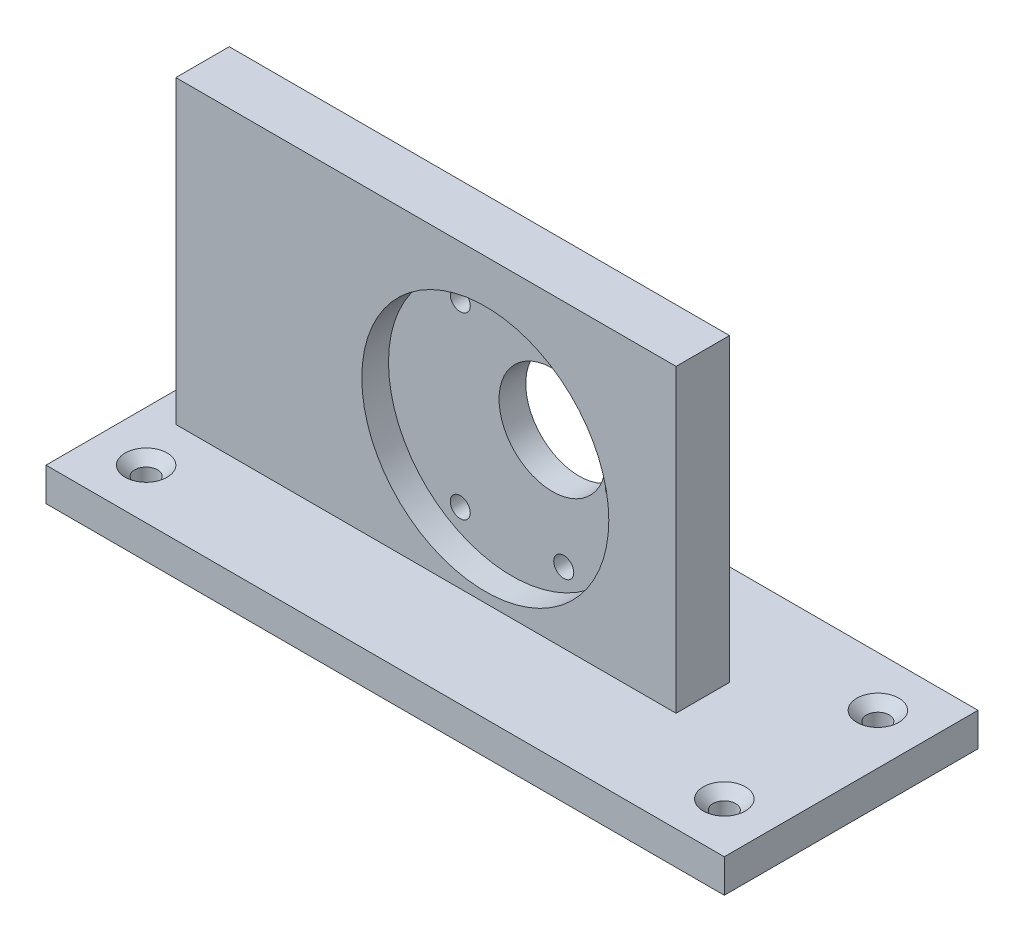
ISO-10303-21;
HEADER;
FILE_DESCRIPTION(('STEP AP214'),'2;1');
FILE_NAME('part.step','',(''),(''),'','','');
FILE_SCHEMA(('AUTOMOTIVE_DESIGN { 1 0 10303 214 1 1 1 1 }'));
ENDSEC;
DATA;
#1=APPLICATION_CONTEXT('core data for automotive mechanical design processes');
#2=APPLICATION_PROTOCOL_DEFINITION('international standard','automotive_design',2000,#1);
#3=PRODUCT_CONTEXT('',#1,'mechanical');
#4=PRODUCT('Part','Part','',(#3));
#5=PRODUCT_RELATED_PRODUCT_CATEGORY('part','',(#4));
#6=PRODUCT_DEFINITION_FORMATION('','',#4);
#7=PRODUCT_DEFINITION_CONTEXT('part definition',#1,'design');
#8=PRODUCT_DEFINITION('design','',#6,#7);
#9=PRODUCT_DEFINITION_SHAPE('','',#8);
#10=(LENGTH_UNIT() NAMED_UNIT(*) SI_UNIT(.MILLI.,.METRE.));
#11=(NAMED_UNIT(*) PLANE_ANGLE_UNIT() SI_UNIT($,.RADIAN.));
#12=(NAMED_UNIT(*) SI_UNIT($,.STERADIAN.) SOLID_ANGLE_UNIT());
#13=UNCERTAINTY_MEASURE_WITH_UNIT(LENGTH_MEASURE(1.E-05),#10,'distance_accuracy_value','');
#14=(GEOMETRIC_REPRESENTATION_CONTEXT(3) GLOBAL_UNCERTAINTY_ASSIGNED_CONTEXT((#13)) GLOBAL_UNIT_ASSIGNED_CONTEXT((#10,
#11,#12)) REPRESENTATION_CONTEXT('',''));
#15=CARTESIAN_POINT('',(0.,0.,0.));
#16=DIRECTION('',(0.,0.,1.));
#17=DIRECTION('',(1.,0.,0.));
#18=AXIS2_PLACEMENT_3D('',#15,#16,#17);
#19=CARTESIAN_POINT('',(-50.8,5.,23.));
#20=DIRECTION('',(0.,-1.,0.));
#21=DIRECTION('',(1.,0.,0.));
#22=AXIS2_PLACEMENT_3D('',#19,#20,#21);
#23=PLANE('',#22);
#24=DIRECTION('',(-1.,0.,0.));
#25=VECTOR('',#24,1.);
#26=CARTESIAN_POINT('',(-50.8,5.,-15.));
#27=LINE('',#26,#25);
#28=CARTESIAN_POINT('',(50.8,5.00000000000002,-15.));
#29=VERTEX_POINT('',#28);
#30=CARTESIAN_POINT('',(-25.7177120902274,5.00000000000001,-15.));
#31=VERTEX_POINT('',#30);
#32=EDGE_CURVE('E258',#29,#31,#27,.T.);
#33=ORIENTED_EDGE('',*,*,#32,.T.);
#34=DIRECTION('',(0.,0.,-1.));
#35=VECTOR('',#34,1.);
#36=CARTESIAN_POINT('',(-25.7177120902274,5.00000000000001,-15.));
#37=LINE('',#36,#35);
#38=CARTESIAN_POINT('',(-25.7177120902274,5.00000000000001,-3.01915184565478));
#39=VERTEX_POINT('',#38);
#40=EDGE_CURVE('E195',#39,#31,#37,.T.);
#41=ORIENTED_EDGE('',*,*,#40,.F.);
#42=DIRECTION('',(1.,0.,0.));
#43=VECTOR('',#42,1.);
#44=CARTESIAN_POINT('',(-50.8,5.,-3.01915184565478));
#45=LINE('',#44,#43);
#46=CARTESIAN_POINT('',(-50.8,5.,-3.01915184565478));
#47=VERTEX_POINT('',#46);
#48=EDGE_CURVE('E191',#47,#39,#45,.T.);
#49=ORIENTED_EDGE('',*,*,#48,.F.);
#50=DIRECTION('',(0.,0.,-1.));
#51=VECTOR('',#50,1.);
#52=CARTESIAN_POINT('',(-50.8,5.,23.));
#53=LINE('',#52,#51);
#54=CARTESIAN_POINT('',(-50.8,5.,23.));
#55=VERTEX_POINT('',#54);
#56=EDGE_CURVE('E275',#55,#47,#53,.T.);
#57=ORIENTED_EDGE('',*,*,#56,.F.);
#58=DIRECTION('',(-1.,0.,0.));
#59=VECTOR('',#58,1.);
#60=CARTESIAN_POINT('',(-50.8,5.,23.));
#61=LINE('',#60,#59);
#62=CARTESIAN_POINT('',(50.8,5.00000000000002,23.));
#63=VERTEX_POINT('',#62);
#64=EDGE_CURVE('E272',#63,#55,#61,.T.);
#65=ORIENTED_EDGE('',*,*,#64,.F.);
#66=DIRECTION('',(0.,0.,-1.));
#67=VECTOR('',#66,1.);
#68=CARTESIAN_POINT('',(50.8,5.00000000000002,23.));
#69=LINE('',#68,#67);
#70=EDGE_CURVE('E279',#63,#29,#69,.T.);
#71=ORIENTED_EDGE('',*,*,#70,.T.);
#72=EDGE_LOOP('',(#33,#41,#49,#57,#65,#71));
#73=FACE_BOUND('',#72,.T.);
#74=CARTESIAN_POINT('',(43.3,5.00000000000002,-7.50000000000001));
#75=DIRECTION('',(0.,1.,0.));
#76=DIRECTION('',(0.,0.,1.));
#77=AXIS2_PLACEMENT_3D('',#74,#75,#76);
#78=CIRCLE('',#77,3.15);
#79=CARTESIAN_POINT('',(43.3,5.00000000000002,-4.35000000000001));
#80=VERTEX_POINT('',#79);
#81=EDGE_CURVE('E239',#80,#80,#78,.T.);
#82=ORIENTED_EDGE('',*,*,#81,.F.);
#83=EDGE_LOOP('',(#82));
#84=FACE_BOUND('',#83,.T.);
#85=CARTESIAN_POINT('',(43.3,5.00000000000002,15.5));
#86=DIRECTION('',(0.,1.,0.));
#87=DIRECTION('',(0.,0.,1.));
#88=AXIS2_PLACEMENT_3D('',#85,#86,#87);
#89=CIRCLE('',#88,3.15);
#90=CARTESIAN_POINT('',(43.3,5.00000000000002,18.65));
#91=VERTEX_POINT('',#90);
#92=EDGE_CURVE('E227',#91,#91,#89,.T.);
#93=ORIENTED_EDGE('',*,*,#92,.F.);
#94=EDGE_LOOP('',(#93));
#95=FACE_BOUND('',#94,.T.);
#96=CARTESIAN_POINT('',(-43.3,5.,15.5));
#97=DIRECTION('',(0.,1.,0.));
#98=DIRECTION('',(0.,0.,1.));
#99=AXIS2_PLACEMENT_3D('',#96,#97,#98);
#100=CIRCLE('',#99,3.15);
#101=CARTESIAN_POINT('',(-43.3,5.,18.65));
#102=VERTEX_POINT('',#101);
#103=EDGE_CURVE('E215',#102,#102,#100,.T.);
#104=ORIENTED_EDGE('',*,*,#103,.F.);
#105=EDGE_LOOP('',(#104));
#106=FACE_BOUND('',#105,.T.);
#107=DIRECTION('',(0.,0.,1.));
#108=VECTOR('',#107,1.);
#109=CARTESIAN_POINT('',(-46.355,5.,8.));
#110=LINE('',#109,#108);
#111=CARTESIAN_POINT('',(-46.355,5.,0.));
#112=VERTEX_POINT('',#111);
#113=CARTESIAN_POINT('',(-46.355,5.,8.));
#114=VERTEX_POINT('',#113);
#115=EDGE_CURVE('E178',#112,#114,#110,.T.);
#116=ORIENTED_EDGE('',*,*,#115,.F.);
#117=DIRECTION('',(-1.,0.,0.));
#118=VECTOR('',#117,1.);
#119=CARTESIAN_POINT('',(0.,5.00000000000001,0.));
#120=LINE('',#119,#118);
#121=CARTESIAN_POINT('',(28.575,5.00000000000002,0.));
#122=VERTEX_POINT('',#121);
#123=EDGE_CURVE('E87',#122,#112,#120,.T.);
#124=ORIENTED_EDGE('',*,*,#123,.F.);
#125=DIRECTION('',(0.,0.,-1.));
#126=VECTOR('',#125,1.);
#127=CARTESIAN_POINT('',(28.575,5.00000000000001,8.));
#128=LINE('',#127,#126);
#129=CARTESIAN_POINT('',(28.575,5.00000000000001,8.));
#130=VERTEX_POINT('',#129);
#131=EDGE_CURVE('E290',#130,#122,#128,.T.);
#132=ORIENTED_EDGE('',*,*,#131,.F.);
#133=DIRECTION('',(-1.,0.,0.));
#134=VECTOR('',#133,1.);
#135=CARTESIAN_POINT('',(0.,5.00000000000001,8.));
#136=LINE('',#135,#134);
#137=EDGE_CURVE('E94',#130,#114,#136,.T.);
#138=ORIENTED_EDGE('',*,*,#137,.T.);
#139=EDGE_LOOP('',(#116,#124,#132,#138));
#140=FACE_BOUND('',#139,.T.);
#141=ADVANCED_FACE('F71',(#73,#84,#95,#106,#140),#23,.F.);
#142=CARTESIAN_POINT('',(28.575,50.,8.));
#143=DIRECTION('',(1.,0.,0.));
#144=DIRECTION('',(0.,1.,0.));
#145=AXIS2_PLACEMENT_3D('',#142,#143,#144);
#146=PLANE('',#145);
#147=DIRECTION('',(0.,-1.,0.));
#148=VECTOR('',#147,1.);
#149=CARTESIAN_POINT('',(28.575,50.,8.));
#150=LINE('',#149,#148);
#151=CARTESIAN_POINT('',(28.575,50.,8.));
#152=VERTEX_POINT('',#151);
#153=EDGE_CURVE('E351',#152,#130,#150,.T.);
#154=ORIENTED_EDGE('',*,*,#153,.T.);
#155=ORIENTED_EDGE('',*,*,#131,.T.);
#156=DIRECTION('',(0.,-1.,0.));
#157=VECTOR('',#156,1.);
#158=CARTESIAN_POINT('',(28.575,50.,0.));
#159=LINE('',#158,#157);
#160=CARTESIAN_POINT('',(28.575,50.,0.));
#161=VERTEX_POINT('',#160);
#162=EDGE_CURVE('E164',#161,#122,#159,.T.);
#163=ORIENTED_EDGE('',*,*,#162,.F.);
#164=DIRECTION('',(0.,0.,-1.));
#165=VECTOR('',#164,1.);
#166=CARTESIAN_POINT('',(28.575,50.,8.));
#167=LINE('',#166,#165);
#168=EDGE_CURVE('E161',#152,#161,#167,.T.);
#169=ORIENTED_EDGE('',*,*,#168,.F.);
#170=EDGE_LOOP('',(#154,#155,#163,#169));
#171=FACE_BOUND('',#170,.T.);
#172=ADVANCED_FACE('F386',(#171),#146,.T.);
#173=CARTESIAN_POINT('',(0.,0.,8.));
#174=DIRECTION('',(0.,0.,-1.));
#175=DIRECTION('',(-1.,0.,0.));
#176=AXIS2_PLACEMENT_3D('',#173,#174,#175);
#177=PLANE('',#176);
#178=CARTESIAN_POINT('',(0.,25.,8.));
#179=DIRECTION('',(0.,0.,1.));
#180=DIRECTION('',(1.,0.,0.));
#181=AXIS2_PLACEMENT_3D('',#178,#179,#180);
#182=CIRCLE('',#181,18.5);
#183=CARTESIAN_POINT('',(18.5,25.,8.));
#184=VERTEX_POINT('',#183);
#185=EDGE_CURVE('E296',#184,#184,#182,.T.);
#186=ORIENTED_EDGE('',*,*,#185,.F.);
#187=EDGE_LOOP('',(#186));
#188=FACE_BOUND('',#187,.T.);
#189=ORIENTED_EDGE('',*,*,#137,.F.);
#190=ORIENTED_EDGE('',*,*,#153,.F.);
#191=DIRECTION('',(1.,0.,0.));
#192=VECTOR('',#191,1.);
#193=CARTESIAN_POINT('',(-28.575,50.,8.));
#194=LINE('',#193,#192);
#195=CARTESIAN_POINT('',(-46.355,50.,8.));
#196=VERTEX_POINT('',#195);
#197=EDGE_CURVE('E348',#196,#152,#194,.T.);
#198=ORIENTED_EDGE('',*,*,#197,.F.);
#199=DIRECTION('',(0.,-1.,0.));
#200=VECTOR('',#199,1.);
#201=CARTESIAN_POINT('',(-46.355,50.,8.));
#202=LINE('',#201,#200);
#203=EDGE_CURVE('E173',#196,#114,#202,.T.);
#204=ORIENTED_EDGE('',*,*,#203,.T.);
#205=EDGE_LOOP('',(#189,#190,#198,#204));
#206=FACE_BOUND('',#205,.T.);
#207=ADVANCED_FACE('F392',(#188,#206),#177,.F.);
#208=CARTESIAN_POINT('',(0.,0.,0.));
#209=DIRECTION('',(0.,0.,-1.));
#210=DIRECTION('',(-1.,0.,0.));
#211=AXIS2_PLACEMENT_3D('',#208,#209,#210);
#212=PLANE('',#211);
#213=CARTESIAN_POINT('',(-38.1178222066704,28.4999999993294,0.));
#214=DIRECTION('',(0.,0.,-1.));
#215=DIRECTION('',(-1.,0.,0.));
#216=AXIS2_PLACEMENT_3D('',#213,#214,#215);
#217=CIRCLE('',#216,6.7056);
#218=CARTESIAN_POINT('',(-44.8234222066704,28.4999999993294,0.));
#219=VERTEX_POINT('',#218);
#220=EDGE_CURVE('E186',#219,#219,#217,.T.);
#221=ORIENTED_EDGE('',*,*,#220,.F.);
#222=EDGE_LOOP('',(#221));
#223=FACE_BOUND('',#222,.T.);
#224=CARTESIAN_POINT('',(-7.74999999999999,38.4233937586588,0.));
#225=DIRECTION('',(0.,0.,1.));
#226=DIRECTION('',(1.,0.,0.));
#227=AXIS2_PLACEMENT_3D('',#224,#225,#226);
#228=CIRCLE('',#227,1.50000000039213);
#229=CARTESIAN_POINT('',(-6.24999999960786,38.4233937586588,0.));
#230=VERTEX_POINT('',#229);
#231=EDGE_CURVE('E330',#230,#230,#228,.T.);
#232=ORIENTED_EDGE('',*,*,#231,.T.);
#233=EDGE_LOOP('',(#232));
#234=FACE_BOUND('',#233,.T.);
#235=CARTESIAN_POINT('',(-7.74999999999999,11.5766062413412,0.));
#236=DIRECTION('',(0.,0.,1.));
#237=DIRECTION('',(1.,0.,0.));
#238=AXIS2_PLACEMENT_3D('',#235,#236,#237);
#239=CIRCLE('',#238,1.50000000039213);
#240=CARTESIAN_POINT('',(-6.24999999960786,11.5766062413412,0.));
#241=VERTEX_POINT('',#240);
#242=EDGE_CURVE('E334',#241,#241,#239,.T.);
#243=ORIENTED_EDGE('',*,*,#242,.T.);
#244=EDGE_LOOP('',(#243));
#245=FACE_BOUND('',#244,.T.);
#246=CARTESIAN_POINT('',(7.75000000000001,11.5766062413412,0.));
#247=DIRECTION('',(0.,0.,1.));
#248=DIRECTION('',(1.,0.,0.));
#249=AXIS2_PLACEMENT_3D('',#246,#247,#248);
#250=CIRCLE('',#249,1.50000000039213);
#251=CARTESIAN_POINT('',(9.25000000039214,11.5766062413412,0.));
#252=VERTEX_POINT('',#251);
#253=EDGE_CURVE('E338',#252,#252,#250,.T.);
#254=ORIENTED_EDGE('',*,*,#253,.T.);
#255=EDGE_LOOP('',(#254));
#256=FACE_BOUND('',#255,.T.);
#257=CARTESIAN_POINT('',(15.5,25.,0.));
#258=DIRECTION('',(0.,0.,1.));
#259=DIRECTION('',(1.,0.,0.));
#260=AXIS2_PLACEMENT_3D('',#257,#258,#259);
#261=CIRCLE('',#260,1.50000000039213);
#262=CARTESIAN_POINT('',(17.0000000003921,25.,0.));
#263=VERTEX_POINT('',#262);
#264=EDGE_CURVE('E329',#263,#263,#261,.T.);
#265=ORIENTED_EDGE('',*,*,#264,.T.);
#266=EDGE_LOOP('',(#265));
#267=FACE_BOUND('',#266,.T.);
#268=CARTESIAN_POINT('',(6.06217782532956,28.4999999993294,0.));
#269=DIRECTION('',(0.,0.,1.));
#270=DIRECTION('',(1.,0.,0.));
#271=AXIS2_PLACEMENT_3D('',#268,#269,#270);
#272=CIRCLE('',#271,8.00000000000001);
#273=CARTESIAN_POINT('',(14.0621778253296,28.4999999993294,0.));
#274=VERTEX_POINT('',#273);
#275=EDGE_CURVE('E325',#274,#274,#272,.T.);
#276=ORIENTED_EDGE('',*,*,#275,.T.);
#277=EDGE_LOOP('',(#276));
#278=FACE_BOUND('',#277,.T.);
#279=CARTESIAN_POINT('',(7.74999999999999,38.4233937586588,0.));
#280=DIRECTION('',(0.,0.,1.));
#281=DIRECTION('',(1.,0.,0.));
#282=AXIS2_PLACEMENT_3D('',#279,#280,#281);
#283=CIRCLE('',#282,1.50000000039214);
#284=CARTESIAN_POINT('',(9.25000000039213,38.4233937586588,0.));
#285=VERTEX_POINT('',#284);
#286=EDGE_CURVE('E165',#285,#285,#283,.T.);
#287=ORIENTED_EDGE('',*,*,#286,.T.);
#288=EDGE_LOOP('',(#287));
#289=FACE_BOUND('',#288,.T.);
#290=ORIENTED_EDGE('',*,*,#162,.T.);
#291=ORIENTED_EDGE('',*,*,#123,.T.);
#292=DIRECTION('',(0.,-1.,0.));
#293=VECTOR('',#292,1.);
#294=CARTESIAN_POINT('',(-46.355,50.,0.));
#295=LINE('',#294,#293);
#296=CARTESIAN_POINT('',(-46.355,50.,0.));
#297=VERTEX_POINT('',#296);
#298=EDGE_CURVE('E168',#297,#112,#295,.T.);
#299=ORIENTED_EDGE('',*,*,#298,.F.);
#300=DIRECTION('',(1.,0.,0.));
#301=VECTOR('',#300,1.);
#302=CARTESIAN_POINT('',(-28.575,50.,0.));
#303=LINE('',#302,#301);
#304=EDGE_CURVE('E156',#297,#161,#303,.T.);
#305=ORIENTED_EDGE('',*,*,#304,.T.);
#306=EDGE_LOOP('',(#290,#291,#299,#305));
#307=FACE_BOUND('',#306,.T.);
#308=ADVANCED_FACE('F169',(#223,#234,#245,#256,#267,#278,#289,#307),#212,.T.);
#309=CARTESIAN_POINT('',(7.74999999999999,38.4233937586588,10.));
#310=DIRECTION('',(0.,0.,-1.));
#311=DIRECTION('',(-1.,0.,0.));
#312=AXIS2_PLACEMENT_3D('',#309,#310,#311);
#313=CYLINDRICAL_SURFACE('',#312,1.50000000039214);
#314=ORIENTED_EDGE('',*,*,#286,.F.);
#315=EDGE_LOOP('',(#314));
#316=FACE_BOUND('',#315,.T.);
#317=CARTESIAN_POINT('',(7.74999999999999,38.4233937586588,4.));
#318=DIRECTION('',(0.,0.,1.));
#319=DIRECTION('',(1.,0.,0.));
#320=AXIS2_PLACEMENT_3D('',#317,#318,#319);
#321=CIRCLE('',#320,1.50000000039214);
#322=CARTESIAN_POINT('',(9.25000000039213,38.4233937586588,4.));
#323=VERTEX_POINT('',#322);
#324=EDGE_CURVE('E321',#323,#323,#321,.T.);
#325=ORIENTED_EDGE('',*,*,#324,.T.);
#326=EDGE_LOOP('',(#325));
#327=FACE_BOUND('',#326,.T.);
#328=ADVANCED_FACE('F419',(#316,#327),#313,.F.);
#329=CARTESIAN_POINT('',(6.06217782532956,28.4999999993294,10.));
#330=DIRECTION('',(0.,0.,-1.));
#331=DIRECTION('',(-1.,0.,0.));
#332=AXIS2_PLACEMENT_3D('',#329,#330,#331);
#333=CYLINDRICAL_SURFACE('',#332,8.00000000000001);
#334=ORIENTED_EDGE('',*,*,#275,.F.);
#335=EDGE_LOOP('',(#334));
#336=FACE_BOUND('',#335,.T.);
#337=CARTESIAN_POINT('',(6.06217782532956,28.4999999993294,4.));
#338=DIRECTION('',(0.,0.,1.));
#339=DIRECTION('',(1.,0.,0.));
#340=AXIS2_PLACEMENT_3D('',#337,#338,#339);
#341=CIRCLE('',#340,8.00000000000001);
#342=CARTESIAN_POINT('',(14.0621778253296,28.4999999993294,4.));
#343=VERTEX_POINT('',#342);
#344=EDGE_CURVE('E317',#343,#343,#341,.T.);
#345=ORIENTED_EDGE('',*,*,#344,.T.);
#346=EDGE_LOOP('',(#345));
#347=FACE_BOUND('',#346,.T.);
#348=ADVANCED_FACE('F415',(#336,#347),#333,.F.);
#349=CARTESIAN_POINT('',(15.5,25.,10.));
#350=DIRECTION('',(0.,0.,-1.));
#351=DIRECTION('',(-1.,0.,0.));
#352=AXIS2_PLACEMENT_3D('',#349,#350,#351);
#353=CYLINDRICAL_SURFACE('',#352,1.50000000039213);
#354=ORIENTED_EDGE('',*,*,#264,.F.);
#355=EDGE_LOOP('',(#354));
#356=FACE_BOUND('',#355,.T.);
#357=CARTESIAN_POINT('',(15.5,25.,4.));
#358=DIRECTION('',(0.,0.,1.));
#359=DIRECTION('',(1.,0.,0.));
#360=AXIS2_PLACEMENT_3D('',#357,#358,#359);
#361=CIRCLE('',#360,1.50000000039213);
#362=CARTESIAN_POINT('',(17.0000000003921,25.,4.));
#363=VERTEX_POINT('',#362);
#364=EDGE_CURVE('E313',#363,#363,#361,.T.);
#365=ORIENTED_EDGE('',*,*,#364,.T.);
#366=EDGE_LOOP('',(#365));
#367=FACE_BOUND('',#366,.T.);
#368=ADVANCED_FACE('F418',(#356,#367),#353,.F.);
#369=CARTESIAN_POINT('',(7.75000000000001,11.5766062413412,10.));
#370=DIRECTION('',(0.,0.,-1.));
#371=DIRECTION('',(-1.,0.,0.));
#372=AXIS2_PLACEMENT_3D('',#369,#370,#371);
#373=CYLINDRICAL_SURFACE('',#372,1.50000000039213);
#374=ORIENTED_EDGE('',*,*,#253,.F.);
#375=EDGE_LOOP('',(#374));
#376=FACE_BOUND('',#375,.T.);
#377=CARTESIAN_POINT('',(7.75000000000001,11.5766062413412,4.));
#378=DIRECTION('',(0.,0.,1.));
#379=DIRECTION('',(1.,0.,0.));
#380=AXIS2_PLACEMENT_3D('',#377,#378,#379);
#381=CIRCLE('',#380,1.50000000039213);
#382=CARTESIAN_POINT('',(9.25000000039214,11.5766062413412,4.));
#383=VERTEX_POINT('',#382);
#384=EDGE_CURVE('E309',#383,#383,#381,.T.);
#385=ORIENTED_EDGE('',*,*,#384,.T.);
#386=EDGE_LOOP('',(#385));
#387=FACE_BOUND('',#386,.T.);
#388=ADVANCED_FACE('F428',(#376,#387),#373,.F.);
#389=CARTESIAN_POINT('',(-7.74999999999999,11.5766062413412,10.));
#390=DIRECTION('',(0.,0.,-1.));
#391=DIRECTION('',(-1.,0.,0.));
#392=AXIS2_PLACEMENT_3D('',#389,#390,#391);
#393=CYLINDRICAL_SURFACE('',#392,1.50000000039213);
#394=ORIENTED_EDGE('',*,*,#242,.F.);
#395=EDGE_LOOP('',(#394));
#396=FACE_BOUND('',#395,.T.);
#397=CARTESIAN_POINT('',(-7.74999999999999,11.5766062413412,4.));
#398=DIRECTION('',(0.,0.,1.));
#399=DIRECTION('',(1.,0.,0.));
#400=AXIS2_PLACEMENT_3D('',#397,#398,#399);
#401=CIRCLE('',#400,1.50000000039213);
#402=CARTESIAN_POINT('',(-6.24999999960786,11.5766062413412,4.));
#403=VERTEX_POINT('',#402);
#404=EDGE_CURVE('E305',#403,#403,#401,.T.);
#405=ORIENTED_EDGE('',*,*,#404,.T.);
#406=EDGE_LOOP('',(#405));
#407=FACE_BOUND('',#406,.T.);
#408=ADVANCED_FACE('F424',(#396,#407),#393,.F.);
#409=CARTESIAN_POINT('',(-7.74999999999999,38.4233937586588,10.));
#410=DIRECTION('',(0.,0.,-1.));
#411=DIRECTION('',(-1.,0.,0.));
#412=AXIS2_PLACEMENT_3D('',#409,#410,#411);
#413=CYLINDRICAL_SURFACE('',#412,1.50000000039213);
#414=ORIENTED_EDGE('',*,*,#231,.F.);
#415=EDGE_LOOP('',(#414));
#416=FACE_BOUND('',#415,.T.);
#417=CARTESIAN_POINT('',(-7.74999999999999,38.4233937586588,4.));
#418=DIRECTION('',(0.,0.,1.));
#419=DIRECTION('',(1.,0.,0.));
#420=AXIS2_PLACEMENT_3D('',#417,#418,#419);
#421=CIRCLE('',#420,1.50000000039213);
#422=CARTESIAN_POINT('',(-6.24999999960786,38.4233937586588,4.));
#423=VERTEX_POINT('',#422);
#424=EDGE_CURVE('E301',#423,#423,#421,.T.);
#425=ORIENTED_EDGE('',*,*,#424,.T.);
#426=EDGE_LOOP('',(#425));
#427=FACE_BOUND('',#426,.T.);
#428=ADVANCED_FACE('F421',(#416,#427),#413,.F.);
#429=CARTESIAN_POINT('',(-28.575,50.,8.));
#430=DIRECTION('',(0.,1.,0.));
#431=DIRECTION('',(-1.,0.,0.));
#432=AXIS2_PLACEMENT_3D('',#429,#430,#431);
#433=PLANE('',#432);
#434=ORIENTED_EDGE('',*,*,#304,.F.);
#435=DIRECTION('',(0.,0.,1.));
#436=VECTOR('',#435,1.);
#437=CARTESIAN_POINT('',(-46.355,50.,8.));
#438=LINE('',#437,#436);
#439=EDGE_CURVE('E159',#297,#196,#438,.T.);
#440=ORIENTED_EDGE('',*,*,#439,.T.);
#441=ORIENTED_EDGE('',*,*,#197,.T.);
#442=ORIENTED_EDGE('',*,*,#168,.T.);
#443=EDGE_LOOP('',(#434,#440,#441,#442));
#444=FACE_BOUND('',#443,.T.);
#445=ADVANCED_FACE('F73',(#444),#433,.T.);
#446=CARTESIAN_POINT('',(0.,25.,4.));
#447=DIRECTION('',(0.,0.,1.));
#448=DIRECTION('',(1.,0.,0.));
#449=AXIS2_PLACEMENT_3D('',#446,#447,#448);
#450=CYLINDRICAL_SURFACE('',#449,18.5);
#451=CARTESIAN_POINT('',(0.,25.,4.));
#452=DIRECTION('',(0.,0.,1.));
#453=DIRECTION('',(1.,0.,0.));
#454=AXIS2_PLACEMENT_3D('',#451,#452,#453);
#455=CIRCLE('',#454,18.5);
#456=CARTESIAN_POINT('',(18.5,25.,4.));
#457=VERTEX_POINT('',#456);
#458=EDGE_CURVE('E297',#457,#457,#455,.T.);
#459=ORIENTED_EDGE('',*,*,#458,.F.);
#460=EDGE_LOOP('',(#459));
#461=FACE_BOUND('',#460,.T.);
#462=ORIENTED_EDGE('',*,*,#185,.T.);
#463=EDGE_LOOP('',(#462));
#464=FACE_BOUND('',#463,.T.);
#465=ADVANCED_FACE('F410',(#461,#464),#450,.F.);
#466=CARTESIAN_POINT('',(0.,25.,4.));
#467=DIRECTION('',(0.,0.,1.));
#468=DIRECTION('',(1.,0.,0.));
#469=AXIS2_PLACEMENT_3D('',#466,#467,#468);
#470=PLANE('',#469);
#471=ORIENTED_EDGE('',*,*,#324,.F.);
#472=EDGE_LOOP('',(#471));
#473=FACE_BOUND('',#472,.T.);
#474=ORIENTED_EDGE('',*,*,#344,.F.);
#475=EDGE_LOOP('',(#474));
#476=FACE_BOUND('',#475,.T.);
#477=ORIENTED_EDGE('',*,*,#364,.F.);
#478=EDGE_LOOP('',(#477));
#479=FACE_BOUND('',#478,.T.);
#480=ORIENTED_EDGE('',*,*,#384,.F.);
#481=EDGE_LOOP('',(#480));
#482=FACE_BOUND('',#481,.T.);
#483=ORIENTED_EDGE('',*,*,#404,.F.);
#484=EDGE_LOOP('',(#483));
#485=FACE_BOUND('',#484,.T.);
#486=ORIENTED_EDGE('',*,*,#424,.F.);
#487=EDGE_LOOP('',(#486));
#488=FACE_BOUND('',#487,.T.);
#489=ORIENTED_EDGE('',*,*,#458,.T.);
#490=EDGE_LOOP('',(#489));
#491=FACE_BOUND('',#490,.T.);
#492=ADVANCED_FACE('F406',(#473,#476,#479,#482,#485,#488,#491),#470,.T.);
#493=CARTESIAN_POINT('',(-50.8,5.,23.));
#494=DIRECTION('',(1.,0.,0.));
#495=DIRECTION('',(0.,0.,-1.));
#496=AXIS2_PLACEMENT_3D('',#493,#494,#495);
#497=PLANE('',#496);
#498=ORIENTED_EDGE('',*,*,#56,.T.);
#499=DIRECTION('',(0.,1.,0.));
#500=VECTOR('',#499,1.);
#501=CARTESIAN_POINT('',(-50.8,-0.00100000000003569,-3.01915184565478));
#502=LINE('',#501,#500);
#503=CARTESIAN_POINT('',(-50.8,0.,-3.01915184565478));
#504=VERTEX_POINT('',#503);
#505=EDGE_CURVE('E198',#504,#47,#502,.T.);
#506=ORIENTED_EDGE('',*,*,#505,.F.);
#507=DIRECTION('',(0.,0.,-1.));
#508=VECTOR('',#507,1.);
#509=CARTESIAN_POINT('',(-50.8,0.,23.));
#510=LINE('',#509,#508);
#511=CARTESIAN_POINT('',(-50.8,0.,23.));
#512=VERTEX_POINT('',#511);
#513=EDGE_CURVE('E286',#512,#504,#510,.T.);
#514=ORIENTED_EDGE('',*,*,#513,.F.);
#515=DIRECTION('',(0.,-1.,0.));
#516=VECTOR('',#515,1.);
#517=CARTESIAN_POINT('',(-50.8,5.,23.));
#518=LINE('',#517,#516);
#519=EDGE_CURVE('E262',#55,#512,#518,.T.);
#520=ORIENTED_EDGE('',*,*,#519,.F.);
#521=EDGE_LOOP('',(#498,#506,#514,#520));
#522=FACE_BOUND('',#521,.T.);
#523=ADVANCED_FACE('F402',(#522),#497,.F.);
#524=CARTESIAN_POINT('',(50.8,5.00000000000002,23.));
#525=DIRECTION('',(-1.,0.,0.));
#526=DIRECTION('',(0.,0.,1.));
#527=AXIS2_PLACEMENT_3D('',#524,#525,#526);
#528=PLANE('',#527);
#529=DIRECTION('',(0.,0.,-1.));
#530=VECTOR('',#529,1.);
#531=CARTESIAN_POINT('',(50.8,0.,23.));
#532=LINE('',#531,#530);
#533=CARTESIAN_POINT('',(50.8,0.,23.));
#534=VERTEX_POINT('',#533);
#535=CARTESIAN_POINT('',(50.8,0.,-15.));
#536=VERTEX_POINT('',#535);
#537=EDGE_CURVE('E282',#534,#536,#532,.T.);
#538=ORIENTED_EDGE('',*,*,#537,.T.);
#539=DIRECTION('',(0.,1.,0.));
#540=VECTOR('',#539,1.);
#541=CARTESIAN_POINT('',(50.8,5.00000000000002,-15.));
#542=LINE('',#541,#540);
#543=EDGE_CURVE('E254',#536,#29,#542,.T.);
#544=ORIENTED_EDGE('',*,*,#543,.T.);
#545=ORIENTED_EDGE('',*,*,#70,.F.);
#546=DIRECTION('',(0.,1.,0.));
#547=VECTOR('',#546,1.);
#548=CARTESIAN_POINT('',(50.8,5.00000000000002,23.));
#549=LINE('',#548,#547);
#550=EDGE_CURVE('E269',#534,#63,#549,.T.);
#551=ORIENTED_EDGE('',*,*,#550,.F.);
#552=EDGE_LOOP('',(#538,#544,#545,#551));
#553=FACE_BOUND('',#552,.T.);
#554=ADVANCED_FACE('F399',(#553),#528,.F.);
#555=CARTESIAN_POINT('',(0.,0.,23.));
#556=DIRECTION('',(0.,0.,1.));
#557=DIRECTION('',(1.,0.,0.));
#558=AXIS2_PLACEMENT_3D('',#555,#556,#557);
#559=PLANE('',#558);
#560=ORIENTED_EDGE('',*,*,#519,.T.);
#561=DIRECTION('',(1.,0.,0.));
#562=VECTOR('',#561,1.);
#563=CARTESIAN_POINT('',(-50.8,0.,23.));
#564=LINE('',#563,#562);
#565=EDGE_CURVE('E266',#512,#534,#564,.T.);
#566=ORIENTED_EDGE('',*,*,#565,.T.);
#567=ORIENTED_EDGE('',*,*,#550,.T.);
#568=ORIENTED_EDGE('',*,*,#64,.T.);
#569=EDGE_LOOP('',(#560,#566,#567,#568));
#570=FACE_BOUND('',#569,.T.);
#571=ADVANCED_FACE('F397',(#570),#559,.T.);
#572=CARTESIAN_POINT('',(0.,0.,-15.));
#573=DIRECTION('',(0.,0.,1.));
#574=DIRECTION('',(1.,0.,0.));
#575=AXIS2_PLACEMENT_3D('',#572,#573,#574);
#576=PLANE('',#575);
#577=DIRECTION('',(1.,0.,0.));
#578=VECTOR('',#577,1.);
#579=CARTESIAN_POINT('',(-50.8,0.,-15.));
#580=LINE('',#579,#578);
#581=CARTESIAN_POINT('',(-25.7177120902274,0.,-15.));
#582=VERTEX_POINT('',#581);
#583=EDGE_CURVE('E251',#582,#536,#580,.T.);
#584=ORIENTED_EDGE('',*,*,#583,.F.);
#585=DIRECTION('',(0.,1.,0.));
#586=VECTOR('',#585,1.);
#587=CARTESIAN_POINT('',(-25.7177120902274,-0.00100000000003049,-15.));
#588=LINE('',#587,#586);
#589=EDGE_CURVE('E199',#582,#31,#588,.T.);
#590=ORIENTED_EDGE('',*,*,#589,.T.);
#591=ORIENTED_EDGE('',*,*,#32,.F.);
#592=ORIENTED_EDGE('',*,*,#543,.F.);
#593=EDGE_LOOP('',(#584,#590,#591,#592));
#594=FACE_BOUND('',#593,.T.);
#595=ADVANCED_FACE('F447',(#594),#576,.F.);
#596=CARTESIAN_POINT('',(-28.575,0.,8.));
#597=DIRECTION('',(0.,1.,0.));
#598=DIRECTION('',(-1.,0.,0.));
#599=AXIS2_PLACEMENT_3D('',#596,#597,#598);
#600=PLANE('',#599);
#601=DIRECTION('',(-0.0254319382276978,0.,-0.999676555950965));
#602=VECTOR('',#601,1.);
#603=CARTESIAN_POINT('',(-32.5487666024315,0.,8.10109328478569));
#604=LINE('',#603,#602);
#605=CARTESIAN_POINT('',(-32.3175387253945,0.,17.1901798375527));
#606=VERTEX_POINT('',#605);
#607=CARTESIAN_POINT('',(-32.4037160435229,0.,13.8027288373025));
#608=VERTEX_POINT('',#607);
#609=EDGE_CURVE('E80',#606,#608,#604,.T.);
#610=ORIENTED_EDGE('',*,*,#609,.T.);
#611=CARTESIAN_POINT('',(-32.2211638512391,0.,15.4929063618942));
#612=DIRECTION('',(0.,1.,0.));
#613=DIRECTION('',(0.999676555950965,0.,-0.0254319382276978));
#614=AXIS2_PLACEMENT_3D('',#611,#612,#613);
#615=ELLIPSE('',#614,1.70110897002671,1.69999999999999);
#616=EDGE_CURVE('E12',#608,#606,#615,.T.);
#617=ORIENTED_EDGE('',*,*,#616,.T.);
#618=EDGE_LOOP('',(#610,#617));
#619=FACE_BOUND('',#618,.T.);
#620=CARTESIAN_POINT('',(-43.3,0.,15.5));
#621=DIRECTION('',(0.,1.,0.));
#622=DIRECTION('',(0.,0.,1.));
#623=AXIS2_PLACEMENT_3D('',#620,#621,#622);
#624=CIRCLE('',#623,1.69999999999999);
#625=CARTESIAN_POINT('',(-43.3,0.,17.2));
#626=VERTEX_POINT('',#625);
#627=EDGE_CURVE('E223',#626,#626,#624,.T.);
#628=ORIENTED_EDGE('',*,*,#627,.T.);
#629=EDGE_LOOP('',(#628));
#630=FACE_BOUND('',#629,.T.);
#631=CARTESIAN_POINT('',(43.3,0.,15.5));
#632=DIRECTION('',(0.,1.,0.));
#633=DIRECTION('',(0.,0.,1.));
#634=AXIS2_PLACEMENT_3D('',#631,#632,#633);
#635=CIRCLE('',#634,1.69999999999999);
#636=CARTESIAN_POINT('',(43.3,0.,17.2));
#637=VERTEX_POINT('',#636);
#638=EDGE_CURVE('E235',#637,#637,#635,.T.);
#639=ORIENTED_EDGE('',*,*,#638,.T.);
#640=EDGE_LOOP('',(#639));
#641=FACE_BOUND('',#640,.T.);
#642=CARTESIAN_POINT('',(43.3,0.,-7.50000000000001));
#643=DIRECTION('',(0.,1.,0.));
#644=DIRECTION('',(0.,0.,1.));
#645=AXIS2_PLACEMENT_3D('',#642,#643,#644);
#646=CIRCLE('',#645,1.69999999999999);
#647=CARTESIAN_POINT('',(43.3,0.,-5.80000000000002));
#648=VERTEX_POINT('',#647);
#649=EDGE_CURVE('E247',#648,#648,#646,.T.);
#650=ORIENTED_EDGE('',*,*,#649,.T.);
#651=EDGE_LOOP('',(#650));
#652=FACE_BOUND('',#651,.T.);
#653=DIRECTION('',(-1.,0.,0.));
#654=VECTOR('',#653,1.);
#655=CARTESIAN_POINT('',(-50.8,0.,-3.01915184565478));
#656=LINE('',#655,#654);
#657=CARTESIAN_POINT('',(-25.7177120902274,0.,-3.01915184565478));
#658=VERTEX_POINT('',#657);
#659=EDGE_CURVE('E203',#658,#504,#656,.T.);
#660=ORIENTED_EDGE('',*,*,#659,.F.);
#661=DIRECTION('',(0.,0.,1.));
#662=VECTOR('',#661,1.);
#663=CARTESIAN_POINT('',(-25.7177120902274,0.,-15.));
#664=LINE('',#663,#662);
#665=EDGE_CURVE('E172',#582,#658,#664,.T.);
#666=ORIENTED_EDGE('',*,*,#665,.F.);
#667=ORIENTED_EDGE('',*,*,#583,.T.);
#668=ORIENTED_EDGE('',*,*,#537,.F.);
#669=ORIENTED_EDGE('',*,*,#565,.F.);
#670=ORIENTED_EDGE('',*,*,#513,.T.);
#671=EDGE_LOOP('',(#660,#666,#667,#668,#669,#670));
#672=FACE_BOUND('',#671,.T.);
#673=ADVANCED_FACE('F366',(#619,#630,#641,#652,#672),#600,.F.);
#674=CARTESIAN_POINT('',(43.3,5.00000000000002,-7.50000000000001));
#675=DIRECTION('',(0.,1.,0.));
#676=DIRECTION('',(0.,0.,1.));
#677=AXIS2_PLACEMENT_3D('',#674,#675,#676);
#678=CYLINDRICAL_SURFACE('',#677,1.69999999999999);
#679=ORIENTED_EDGE('',*,*,#649,.F.);
#680=EDGE_LOOP('',(#679));
#681=FACE_BOUND('',#680,.T.);
#682=CARTESIAN_POINT('',(43.3,3.55000000000001,-7.50000000000001));
#683=DIRECTION('',(0.,1.,0.));
#684=DIRECTION('',(0.,0.,1.));
#685=AXIS2_PLACEMENT_3D('',#682,#683,#684);
#686=CIRCLE('',#685,1.69999999999999);
#687=CARTESIAN_POINT('',(43.3,3.55000000000001,-5.80000000000002));
#688=VERTEX_POINT('',#687);
#689=EDGE_CURVE('E243',#688,#688,#686,.T.);
#690=ORIENTED_EDGE('',*,*,#689,.T.);
#691=EDGE_LOOP('',(#690));
#692=FACE_BOUND('',#691,.T.);
#693=ADVANCED_FACE('F446',(#681,#692),#678,.F.);
#694=CARTESIAN_POINT('',(43.3,5.00000000000002,-7.50000000000001));
#695=DIRECTION('',(0.,1.,0.));
#696=DIRECTION('',(0.,0.,1.));
#697=AXIS2_PLACEMENT_3D('',#694,#695,#696);
#698=CONICAL_SURFACE('',#697,3.15,0.78539816339745);
#699=ORIENTED_EDGE('',*,*,#689,.F.);
#700=EDGE_LOOP('',(#699));
#701=FACE_BOUND('',#700,.T.);
#702=ORIENTED_EDGE('',*,*,#81,.T.);
#703=EDGE_LOOP('',(#702));
#704=FACE_BOUND('',#703,.T.);
#705=ADVANCED_FACE('F452',(#701,#704),#698,.F.);
#706=CARTESIAN_POINT('',(43.3,5.00000000000002,15.5));
#707=DIRECTION('',(0.,1.,0.));
#708=DIRECTION('',(0.,0.,1.));
#709=AXIS2_PLACEMENT_3D('',#706,#707,#708);
#710=CYLINDRICAL_SURFACE('',#709,1.69999999999999);
#711=ORIENTED_EDGE('',*,*,#638,.F.);
#712=EDGE_LOOP('',(#711));
#713=FACE_BOUND('',#712,.T.);
#714=CARTESIAN_POINT('',(43.3,3.55000000000001,15.5));
#715=DIRECTION('',(0.,1.,0.));
#716=DIRECTION('',(0.,0.,1.));
#717=AXIS2_PLACEMENT_3D('',#714,#715,#716);
#718=CIRCLE('',#717,1.69999999999999);
#719=CARTESIAN_POINT('',(43.3,3.55000000000001,17.2));
#720=VERTEX_POINT('',#719);
#721=EDGE_CURVE('E231',#720,#720,#718,.T.);
#722=ORIENTED_EDGE('',*,*,#721,.T.);
#723=EDGE_LOOP('',(#722));
#724=FACE_BOUND('',#723,.T.);
#725=ADVANCED_FACE('F464',(#713,#724),#710,.F.);
#726=CARTESIAN_POINT('',(43.3,5.00000000000002,15.5));
#727=DIRECTION('',(0.,1.,0.));
#728=DIRECTION('',(0.,0.,1.));
#729=AXIS2_PLACEMENT_3D('',#726,#727,#728);
#730=CONICAL_SURFACE('',#729,3.15,0.78539816339745);
#731=ORIENTED_EDGE('',*,*,#721,.F.);
#732=EDGE_LOOP('',(#731));
#733=FACE_BOUND('',#732,.T.);
#734=ORIENTED_EDGE('',*,*,#92,.T.);
#735=EDGE_LOOP('',(#734));
#736=FACE_BOUND('',#735,.T.);
#737=ADVANCED_FACE('F468',(#733,#736),#730,.F.);
#738=CARTESIAN_POINT('',(-43.3,5.,15.5));
#739=DIRECTION('',(0.,1.,0.));
#740=DIRECTION('',(0.,0.,1.));
#741=AXIS2_PLACEMENT_3D('',#738,#739,#740);
#742=CYLINDRICAL_SURFACE('',#741,1.69999999999999);
#743=ORIENTED_EDGE('',*,*,#627,.F.);
#744=EDGE_LOOP('',(#743));
#745=FACE_BOUND('',#744,.T.);
#746=CARTESIAN_POINT('',(-43.3,3.54999999999999,15.5));
#747=DIRECTION('',(0.,1.,0.));
#748=DIRECTION('',(0.,0.,1.));
#749=AXIS2_PLACEMENT_3D('',#746,#747,#748);
#750=CIRCLE('',#749,1.69999999999999);
#751=CARTESIAN_POINT('',(-43.3,3.54999999999999,17.2));
#752=VERTEX_POINT('',#751);
#753=EDGE_CURVE('E219',#752,#752,#750,.T.);
#754=ORIENTED_EDGE('',*,*,#753,.T.);
#755=EDGE_LOOP('',(#754));
#756=FACE_BOUND('',#755,.T.);
#757=ADVANCED_FACE('F382',(#745,#756),#742,.F.);
#758=CARTESIAN_POINT('',(-43.3,5.,15.5));
#759=DIRECTION('',(0.,1.,0.));
#760=DIRECTION('',(0.,0.,1.));
#761=AXIS2_PLACEMENT_3D('',#758,#759,#760);
#762=CONICAL_SURFACE('',#761,3.15,0.78539816339745);
#763=ORIENTED_EDGE('',*,*,#753,.F.);
#764=EDGE_LOOP('',(#763));
#765=FACE_BOUND('',#764,.T.);
#766=ORIENTED_EDGE('',*,*,#103,.T.);
#767=EDGE_LOOP('',(#766));
#768=FACE_BOUND('',#767,.T.);
#769=ADVANCED_FACE('F374',(#765,#768),#762,.F.);
#770=CARTESIAN_POINT('',(-32.57926504209,-9.91573705929179,15.5020165158843));
#771=DIRECTION('',(0.0360908865319122,0.999348089954104,-0.000918158169658495));
#772=DIRECTION('',(-0.999348511186798,0.0360909017444908,0.));
#773=AXIS2_PLACEMENT_3D('',#770,#771,#772);
#774=CYLINDRICAL_SURFACE('',#773,1.69999999999999);
#775=CARTESIAN_POINT('',(-32.2213456273256,-0.00503333673221654,15.4929109863081));
#776=DIRECTION('',(0.0360908865319122,0.999348089954104,-0.000918158169658495));
#777=DIRECTION('',(-0.999348511186798,0.0360909017444907,0.));
#778=AXIS2_PLACEMENT_3D('',#775,#776,#777);
#779=CIRCLE('',#778,1.69999999999999);
#780=EDGE_CURVE('E211',#608,#606,#779,.T.);
#781=ORIENTED_EDGE('',*,*,#780,.T.);
#782=ORIENTED_EDGE('',*,*,#616,.F.);
#783=EDGE_LOOP('',(#781,#782));
#784=FACE_BOUND('',#783,.T.);
#785=ADVANCED_FACE('F372',(#784),#774,.F.);
#786=CARTESIAN_POINT('',(-32.2213456273256,-0.00503333673221654,15.4929109863081));
#787=DIRECTION('',(0.0360908865319122,0.999348089954104,-0.000918158169658495));
#788=DIRECTION('',(-0.999348511186798,0.0360909017444907,0.));
#789=AXIS2_PLACEMENT_3D('',#786,#787,#788);
#790=PLANE('',#789);
#791=ORIENTED_EDGE('',*,*,#780,.F.);
#792=ORIENTED_EDGE('',*,*,#609,.F.);
#793=EDGE_LOOP('',(#791,#792));
#794=FACE_BOUND('',#793,.T.);
#795=ADVANCED_FACE('F370',(#794),#790,.F.);
#796=CARTESIAN_POINT('',(-25.7177120902274,-0.00100000000003049,-15.));
#797=DIRECTION('',(1.,0.,0.));
#798=DIRECTION('',(0.,1.,0.));
#799=AXIS2_PLACEMENT_3D('',#796,#797,#798);
#800=PLANE('',#799);
#801=ORIENTED_EDGE('',*,*,#665,.T.);
#802=DIRECTION('',(0.,1.,0.));
#803=VECTOR('',#802,1.);
#804=CARTESIAN_POINT('',(-25.7177120902274,-0.00100000000003049,-3.01915184565478));
#805=LINE('',#804,#803);
#806=EDGE_CURVE('E204',#658,#39,#805,.T.);
#807=ORIENTED_EDGE('',*,*,#806,.T.);
#808=ORIENTED_EDGE('',*,*,#40,.T.);
#809=ORIENTED_EDGE('',*,*,#589,.F.);
#810=EDGE_LOOP('',(#801,#807,#808,#809));
#811=FACE_BOUND('',#810,.T.);
#812=ADVANCED_FACE('F380',(#811),#800,.F.);
#813=CARTESIAN_POINT('',(-50.8,-0.00100000000003569,-3.01915184565478));
#814=DIRECTION('',(0.,0.,1.));
#815=DIRECTION('',(1.,0.,0.));
#816=AXIS2_PLACEMENT_3D('',#813,#814,#815);
#817=PLANE('',#816);
#818=ORIENTED_EDGE('',*,*,#659,.T.);
#819=ORIENTED_EDGE('',*,*,#505,.T.);
#820=ORIENTED_EDGE('',*,*,#48,.T.);
#821=ORIENTED_EDGE('',*,*,#806,.F.);
#822=EDGE_LOOP('',(#818,#819,#820,#821));
#823=FACE_BOUND('',#822,.T.);
#824=ADVANCED_FACE('F496',(#823),#817,.F.);
#825=CARTESIAN_POINT('',(-46.355,50.,8.));
#826=DIRECTION('',(1.,0.,0.));
#827=DIRECTION('',(0.,1.,0.));
#828=AXIS2_PLACEMENT_3D('',#825,#826,#827);
#829=PLANE('',#828);
#830=ORIENTED_EDGE('',*,*,#115,.T.);
#831=ORIENTED_EDGE('',*,*,#203,.F.);
#832=ORIENTED_EDGE('',*,*,#439,.F.);
#833=ORIENTED_EDGE('',*,*,#298,.T.);
#834=EDGE_LOOP('',(#830,#831,#832,#833));
#835=FACE_BOUND('',#834,.T.);
#836=ADVANCED_FACE('F175',(#835),#829,.F.);
#837=CARTESIAN_POINT('',(-38.1178222066704,28.4999999993294,-5.08));
#838=DIRECTION('',(0.,0.,1.));
#839=DIRECTION('',(1.,0.,0.));
#840=AXIS2_PLACEMENT_3D('',#837,#838,#839);
#841=CYLINDRICAL_SURFACE('',#840,4.8006);
#842=CARTESIAN_POINT('',(-38.1178222066704,28.4999999993294,-5.08));
#843=DIRECTION('',(0.,0.,-1.));
#844=DIRECTION('',(-1.,0.,0.));
#845=AXIS2_PLACEMENT_3D('',#842,#843,#844);
#846=CIRCLE('',#845,4.8006);
#847=CARTESIAN_POINT('',(-42.9184222066704,28.4999999993294,-5.08));
#848=VERTEX_POINT('',#847);
#849=EDGE_CURVE('E183',#848,#848,#846,.T.);
#850=ORIENTED_EDGE('',*,*,#849,.T.);
#851=EDGE_LOOP('',(#850));
#852=FACE_BOUND('',#851,.T.);
#853=CARTESIAN_POINT('',(-38.1178222066704,28.4999999993294,5.08));
#854=DIRECTION('',(0.,0.,-1.));
#855=DIRECTION('',(-1.,0.,0.));
#856=AXIS2_PLACEMENT_3D('',#853,#854,#855);
#857=CIRCLE('',#856,4.8006);
#858=CARTESIAN_POINT('',(-42.9184222066704,28.4999999993294,5.08));
#859=VERTEX_POINT('',#858);
#860=EDGE_CURVE('E536',#859,#859,#857,.T.);
#861=ORIENTED_EDGE('',*,*,#860,.F.);
#862=EDGE_LOOP('',(#861));
#863=FACE_BOUND('',#862,.T.);
#864=ADVANCED_FACE('F517',(#852,#863),#841,.F.);
#865=CARTESIAN_POINT('',(-38.1178222066704,28.4999999993294,-5.08));
#866=DIRECTION('',(0.,0.,1.));
#867=DIRECTION('',(1.,0.,0.));
#868=AXIS2_PLACEMENT_3D('',#865,#866,#867);
#869=CYLINDRICAL_SURFACE('',#868,6.7056);
#870=CARTESIAN_POINT('',(-38.1178222066704,28.4999999993294,-5.08));
#871=DIRECTION('',(0.,0.,-1.));
#872=DIRECTION('',(-1.,0.,0.));
#873=AXIS2_PLACEMENT_3D('',#870,#871,#872);
#874=CIRCLE('',#873,6.7056);
#875=CARTESIAN_POINT('',(-44.8234222066704,28.4999999993294,-5.08));
#876=VERTEX_POINT('',#875);
#877=EDGE_CURVE('E542',#876,#876,#874,.T.);
#878=ORIENTED_EDGE('',*,*,#877,.F.);
#879=EDGE_LOOP('',(#878));
#880=FACE_BOUND('',#879,.T.);
#881=ORIENTED_EDGE('',*,*,#220,.T.);
#882=EDGE_LOOP('',(#881));
#883=FACE_BOUND('',#882,.T.);
#884=ADVANCED_FACE('F518',(#880,#883),#869,.T.);
#885=CARTESIAN_POINT('',(0.,0.,-5.08));
#886=DIRECTION('',(0.,0.,-1.));
#887=DIRECTION('',(-1.,0.,0.));
#888=AXIS2_PLACEMENT_3D('',#885,#886,#887);
#889=PLANE('',#888);
#890=ORIENTED_EDGE('',*,*,#877,.T.);
#891=EDGE_LOOP('',(#890));
#892=FACE_BOUND('',#891,.T.);
#893=ORIENTED_EDGE('',*,*,#849,.F.);
#894=EDGE_LOOP('',(#893));
#895=FACE_BOUND('',#894,.T.);
#896=ADVANCED_FACE('F521',(#892,#895),#889,.T.);
#897=CARTESIAN_POINT('',(-38.1178222066704,28.4999999993294,5.08));
#898=DIRECTION('',(0.,0.,-1.));
#899=DIRECTION('',(-1.,0.,0.));
#900=AXIS2_PLACEMENT_3D('',#897,#898,#899);
#901=PLANE('',#900);
#902=ORIENTED_EDGE('',*,*,#860,.T.);
#903=EDGE_LOOP('',(#902));
#904=FACE_BOUND('',#903,.T.);
#905=ADVANCED_FACE('F528',(#904),#901,.T.);
#906=CLOSED_SHELL('',(#141,#172,#207,#308,#328,#348,#368,#388,#408,#428,#445,#465,#492,#523,
#554,#571,#595,#673,#693,#705,#725,#737,#757,#769,#785,#795,#812,#824,#836,#864,#884,#896,#905));
#907=MANIFOLD_SOLID_BREP('B2',#906);
#908=ADVANCED_BREP_SHAPE_REPRESENTATION('',(#18,#907),#14);
#909=SHAPE_DEFINITION_REPRESENTATION(#9,#908);
ENDSEC;
END-ISO-10303-21;
